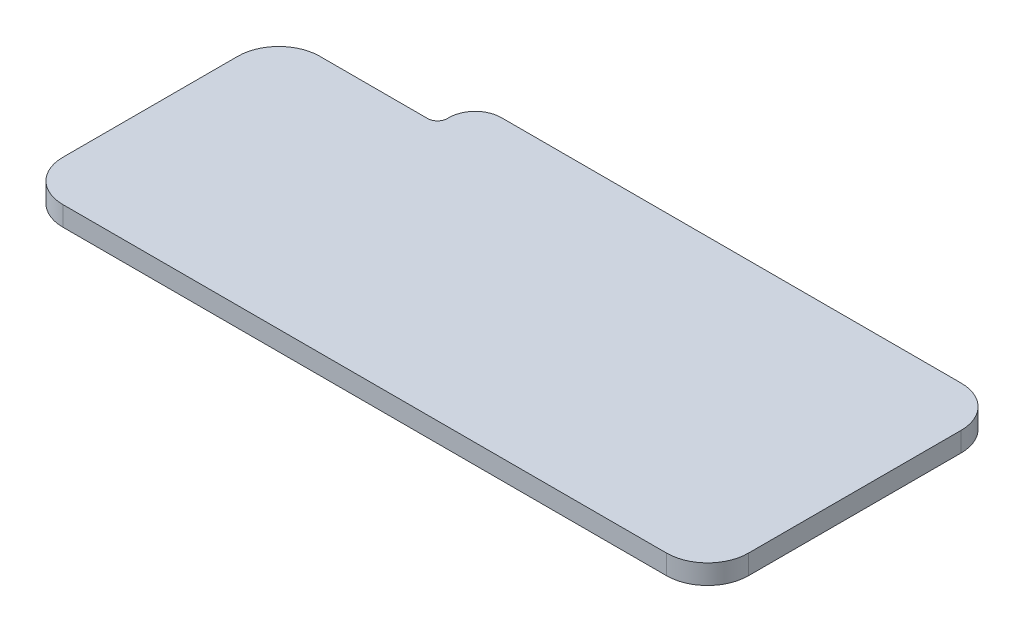
ISO-10303-21;
HEADER;
FILE_DESCRIPTION(('STEP AP214'),'2;1');
FILE_NAME('part.step','',(''),(''),'','','');
FILE_SCHEMA(('AUTOMOTIVE_DESIGN { 1 0 10303 214 1 1 1 1 }'));
ENDSEC;
DATA;
#1=APPLICATION_CONTEXT('core data for automotive mechanical design processes');
#2=APPLICATION_PROTOCOL_DEFINITION('international standard','automotive_design',2000,#1);
#3=PRODUCT_CONTEXT('',#1,'mechanical');
#4=PRODUCT('Part','Part','',(#3));
#5=PRODUCT_RELATED_PRODUCT_CATEGORY('part','',(#4));
#6=PRODUCT_DEFINITION_FORMATION('','',#4);
#7=PRODUCT_DEFINITION_CONTEXT('part definition',#1,'design');
#8=PRODUCT_DEFINITION('design','',#6,#7);
#9=PRODUCT_DEFINITION_SHAPE('','',#8);
#10=(LENGTH_UNIT() NAMED_UNIT(*) SI_UNIT(.MILLI.,.METRE.));
#11=(NAMED_UNIT(*) PLANE_ANGLE_UNIT() SI_UNIT($,.RADIAN.));
#12=(NAMED_UNIT(*) SI_UNIT($,.STERADIAN.) SOLID_ANGLE_UNIT());
#13=UNCERTAINTY_MEASURE_WITH_UNIT(LENGTH_MEASURE(1.E-05),#10,'distance_accuracy_value','');
#14=(GEOMETRIC_REPRESENTATION_CONTEXT(3) GLOBAL_UNCERTAINTY_ASSIGNED_CONTEXT((#13)) GLOBAL_UNIT_ASSIGNED_CONTEXT((#10,
#11,#12)) REPRESENTATION_CONTEXT('',''));
#15=CARTESIAN_POINT('',(0.,0.,0.));
#16=DIRECTION('',(0.,0.,1.));
#17=DIRECTION('',(1.,0.,0.));
#18=AXIS2_PLACEMENT_3D('',#15,#16,#17);
#19=CARTESIAN_POINT('',(0.,12.,0.));
#20=DIRECTION('',(0.,0.,-1.));
#21=DIRECTION('',(-1.,0.,0.));
#22=AXIS2_PLACEMENT_3D('',#19,#20,#21);
#23=PLANE('',#22);
#24=DIRECTION('',(1.,0.,0.));
#25=VECTOR('',#24,1.);
#26=CARTESIAN_POINT('',(0.,0.,0.));
#27=LINE('',#26,#25);
#28=CARTESIAN_POINT('',(-71.9999999999998,0.,0.));
#29=VERTEX_POINT('',#28);
#30=CARTESIAN_POINT('',(297.,0.,0.));
#31=VERTEX_POINT('',#30);
#32=EDGE_CURVE('E107',#29,#31,#27,.T.);
#33=ORIENTED_EDGE('',*,*,#32,.T.);
#34=DIRECTION('',(0.,-1.,0.));
#35=VECTOR('',#34,1.);
#36=CARTESIAN_POINT('',(297.,12.,0.));
#37=LINE('',#36,#35);
#38=CARTESIAN_POINT('',(297.,12.,0.));
#39=VERTEX_POINT('',#38);
#40=EDGE_CURVE('E11',#39,#31,#37,.T.);
#41=ORIENTED_EDGE('',*,*,#40,.F.);
#42=DIRECTION('',(1.,0.,0.));
#43=VECTOR('',#42,1.);
#44=CARTESIAN_POINT('',(0.,12.,0.));
#45=LINE('',#44,#43);
#46=CARTESIAN_POINT('',(-71.9999999999998,12.,0.));
#47=VERTEX_POINT('',#46);
#48=EDGE_CURVE('E113',#47,#39,#45,.T.);
#49=ORIENTED_EDGE('',*,*,#48,.F.);
#50=DIRECTION('',(0.,-1.,0.));
#51=VECTOR('',#50,1.);
#52=CARTESIAN_POINT('',(-71.9999999999998,12.,0.));
#53=LINE('',#52,#51);
#54=EDGE_CURVE('E159',#47,#29,#53,.T.);
#55=ORIENTED_EDGE('',*,*,#54,.T.);
#56=EDGE_LOOP('',(#33,#41,#49,#55));
#57=FACE_BOUND('',#56,.T.);
#58=ADVANCED_FACE('F43',(#57),#23,.F.);
#59=CARTESIAN_POINT('',(297.,12.,-25.));
#60=DIRECTION('',(0.,-1.,0.));
#61=DIRECTION('',(0.,0.,-1.));
#62=AXIS2_PLACEMENT_3D('',#59,#60,#61);
#63=CYLINDRICAL_SURFACE('',#62,25.);
#64=CARTESIAN_POINT('',(297.,0.,-25.));
#65=DIRECTION('',(0.,1.,0.));
#66=DIRECTION('',(0.,0.,1.));
#67=AXIS2_PLACEMENT_3D('',#64,#65,#66);
#68=CIRCLE('',#67,25.);
#69=CARTESIAN_POINT('',(322.,0.,-25.0000000000002));
#70=VERTEX_POINT('',#69);
#71=EDGE_CURVE('E164',#31,#70,#68,.T.);
#72=ORIENTED_EDGE('',*,*,#71,.T.);
#73=DIRECTION('',(0.,-1.,0.));
#74=VECTOR('',#73,1.);
#75=CARTESIAN_POINT('',(322.,12.,-25.0000000000002));
#76=LINE('',#75,#74);
#77=CARTESIAN_POINT('',(322.,12.,-25.0000000000002));
#78=VERTEX_POINT('',#77);
#79=EDGE_CURVE('E51',#78,#70,#76,.T.);
#80=ORIENTED_EDGE('',*,*,#79,.F.);
#81=CARTESIAN_POINT('',(297.,12.,-25.));
#82=DIRECTION('',(0.,1.,0.));
#83=DIRECTION('',(0.,0.,1.));
#84=AXIS2_PLACEMENT_3D('',#81,#82,#83);
#85=CIRCLE('',#84,25.);
#86=EDGE_CURVE('E252',#39,#78,#85,.T.);
#87=ORIENTED_EDGE('',*,*,#86,.F.);
#88=ORIENTED_EDGE('',*,*,#40,.T.);
#89=EDGE_LOOP('',(#72,#80,#87,#88));
#90=FACE_BOUND('',#89,.T.);
#91=ADVANCED_FACE('F255',(#90),#63,.T.);
#92=CARTESIAN_POINT('',(322.,12.,-25.0000000000002));
#93=DIRECTION('',(-1.,0.,0.));
#94=DIRECTION('',(0.,0.,1.));
#95=AXIS2_PLACEMENT_3D('',#92,#93,#94);
#96=PLANE('',#95);
#97=DIRECTION('',(0.,0.,-1.));
#98=VECTOR('',#97,1.);
#99=CARTESIAN_POINT('',(322.,0.,-25.0000000000002));
#100=LINE('',#99,#98);
#101=CARTESIAN_POINT('',(322.,0.,-155.));
#102=VERTEX_POINT('',#101);
#103=EDGE_CURVE('E166',#70,#102,#100,.T.);
#104=ORIENTED_EDGE('',*,*,#103,.T.);
#105=DIRECTION('',(0.,-1.,0.));
#106=VECTOR('',#105,1.);
#107=CARTESIAN_POINT('',(322.,12.,-155.));
#108=LINE('',#107,#106);
#109=CARTESIAN_POINT('',(322.,12.,-155.));
#110=VERTEX_POINT('',#109);
#111=EDGE_CURVE('E203',#110,#102,#108,.T.);
#112=ORIENTED_EDGE('',*,*,#111,.F.);
#113=DIRECTION('',(0.,0.,-1.));
#114=VECTOR('',#113,1.);
#115=CARTESIAN_POINT('',(322.,12.,-25.0000000000002));
#116=LINE('',#115,#114);
#117=EDGE_CURVE('E212',#78,#110,#116,.T.);
#118=ORIENTED_EDGE('',*,*,#117,.F.);
#119=ORIENTED_EDGE('',*,*,#79,.T.);
#120=EDGE_LOOP('',(#104,#112,#118,#119));
#121=FACE_BOUND('',#120,.T.);
#122=ADVANCED_FACE('F210',(#121),#96,.F.);
#123=CARTESIAN_POINT('',(297.,12.,-155.));
#124=DIRECTION('',(0.,-1.,0.));
#125=DIRECTION('',(0.,0.,-1.));
#126=AXIS2_PLACEMENT_3D('',#123,#124,#125);
#127=CYLINDRICAL_SURFACE('',#126,25.);
#128=CARTESIAN_POINT('',(297.,0.,-155.));
#129=DIRECTION('',(0.,1.,0.));
#130=DIRECTION('',(0.,0.,-1.));
#131=AXIS2_PLACEMENT_3D('',#128,#129,#130);
#132=CIRCLE('',#131,25.);
#133=CARTESIAN_POINT('',(297.,0.,-180.));
#134=VERTEX_POINT('',#133);
#135=EDGE_CURVE('E168',#102,#134,#132,.T.);
#136=ORIENTED_EDGE('',*,*,#135,.T.);
#137=DIRECTION('',(0.,-1.,0.));
#138=VECTOR('',#137,1.);
#139=CARTESIAN_POINT('',(297.,12.,-180.));
#140=LINE('',#139,#138);
#141=CARTESIAN_POINT('',(297.,12.,-180.));
#142=VERTEX_POINT('',#141);
#143=EDGE_CURVE('E200',#142,#134,#140,.T.);
#144=ORIENTED_EDGE('',*,*,#143,.F.);
#145=CARTESIAN_POINT('',(297.,12.,-155.));
#146=DIRECTION('',(0.,1.,0.));
#147=DIRECTION('',(0.,0.,-1.));
#148=AXIS2_PLACEMENT_3D('',#145,#146,#147);
#149=CIRCLE('',#148,25.);
#150=EDGE_CURVE('E230',#110,#142,#149,.T.);
#151=ORIENTED_EDGE('',*,*,#150,.F.);
#152=ORIENTED_EDGE('',*,*,#111,.T.);
#153=EDGE_LOOP('',(#136,#144,#151,#152));
#154=FACE_BOUND('',#153,.T.);
#155=ADVANCED_FACE('F221',(#154),#127,.T.);
#156=CARTESIAN_POINT('',(16.0000000000001,12.,-180.));
#157=DIRECTION('',(0.,0.,1.));
#158=DIRECTION('',(1.,0.,0.));
#159=AXIS2_PLACEMENT_3D('',#156,#157,#158);
#160=PLANE('',#159);
#161=DIRECTION('',(-1.,0.,0.));
#162=VECTOR('',#161,1.);
#163=CARTESIAN_POINT('',(16.0000000000001,0.,-180.));
#164=LINE('',#163,#162);
#165=CARTESIAN_POINT('',(16.0000000000001,0.,-180.));
#166=VERTEX_POINT('',#165);
#167=EDGE_CURVE('E170',#134,#166,#164,.T.);
#168=ORIENTED_EDGE('',*,*,#167,.T.);
#169=DIRECTION('',(0.,-1.,0.));
#170=VECTOR('',#169,1.);
#171=CARTESIAN_POINT('',(16.0000000000001,12.,-180.));
#172=LINE('',#171,#170);
#173=CARTESIAN_POINT('',(16.0000000000001,12.,-180.));
#174=VERTEX_POINT('',#173);
#175=EDGE_CURVE('E197',#174,#166,#172,.T.);
#176=ORIENTED_EDGE('',*,*,#175,.F.);
#177=DIRECTION('',(-1.,0.,0.));
#178=VECTOR('',#177,1.);
#179=CARTESIAN_POINT('',(16.0000000000001,12.,-180.));
#180=LINE('',#179,#178);
#181=EDGE_CURVE('E227',#142,#174,#180,.T.);
#182=ORIENTED_EDGE('',*,*,#181,.F.);
#183=ORIENTED_EDGE('',*,*,#143,.T.);
#184=EDGE_LOOP('',(#168,#176,#182,#183));
#185=FACE_BOUND('',#184,.T.);
#186=ADVANCED_FACE('F225',(#185),#160,.F.);
#187=CARTESIAN_POINT('',(16.,12.,-164.));
#188=DIRECTION('',(0.,-1.,0.));
#189=DIRECTION('',(0.,0.,-1.));
#190=AXIS2_PLACEMENT_3D('',#187,#188,#189);
#191=CYLINDRICAL_SURFACE('',#190,16.);
#192=CARTESIAN_POINT('',(16.,0.,-164.));
#193=DIRECTION('',(0.,1.,0.));
#194=DIRECTION('',(0.,0.,-1.));
#195=AXIS2_PLACEMENT_3D('',#192,#193,#194);
#196=CIRCLE('',#195,16.);
#197=CARTESIAN_POINT('',(0.,0.,-164.));
#198=VERTEX_POINT('',#197);
#199=EDGE_CURVE('E172',#166,#198,#196,.T.);
#200=ORIENTED_EDGE('',*,*,#199,.T.);
#201=DIRECTION('',(0.,-1.,0.));
#202=VECTOR('',#201,1.);
#203=CARTESIAN_POINT('',(0.,12.,-164.));
#204=LINE('',#203,#202);
#205=CARTESIAN_POINT('',(0.,12.,-164.));
#206=VERTEX_POINT('',#205);
#207=EDGE_CURVE('E194',#206,#198,#204,.T.);
#208=ORIENTED_EDGE('',*,*,#207,.F.);
#209=CARTESIAN_POINT('',(16.,12.,-164.));
#210=DIRECTION('',(0.,1.,0.));
#211=DIRECTION('',(0.,0.,-1.));
#212=AXIS2_PLACEMENT_3D('',#209,#210,#211);
#213=CIRCLE('',#212,16.);
#214=EDGE_CURVE('E229',#174,#206,#213,.T.);
#215=ORIENTED_EDGE('',*,*,#214,.F.);
#216=ORIENTED_EDGE('',*,*,#175,.T.);
#217=EDGE_LOOP('',(#200,#208,#215,#216));
#218=FACE_BOUND('',#217,.T.);
#219=ADVANCED_FACE('F267',(#218),#191,.T.);
#220=CARTESIAN_POINT('',(0.,12.,-162.982));
#221=DIRECTION('',(1.,0.,0.));
#222=DIRECTION('',(0.,0.,-1.));
#223=AXIS2_PLACEMENT_3D('',#220,#221,#222);
#224=PLANE('',#223);
#225=DIRECTION('',(0.,0.,1.));
#226=VECTOR('',#225,1.);
#227=CARTESIAN_POINT('',(0.,0.,-162.982));
#228=LINE('',#227,#226);
#229=CARTESIAN_POINT('',(0.,0.,-162.982));
#230=VERTEX_POINT('',#229);
#231=EDGE_CURVE('E174',#198,#230,#228,.T.);
#232=ORIENTED_EDGE('',*,*,#231,.T.);
#233=DIRECTION('',(0.,-1.,0.));
#234=VECTOR('',#233,1.);
#235=CARTESIAN_POINT('',(0.,12.,-162.982));
#236=LINE('',#235,#234);
#237=CARTESIAN_POINT('',(0.,12.,-162.982));
#238=VERTEX_POINT('',#237);
#239=EDGE_CURVE('E191',#238,#230,#236,.T.);
#240=ORIENTED_EDGE('',*,*,#239,.F.);
#241=DIRECTION('',(0.,0.,1.));
#242=VECTOR('',#241,1.);
#243=CARTESIAN_POINT('',(0.,12.,-162.982));
#244=LINE('',#243,#242);
#245=EDGE_CURVE('E232',#206,#238,#244,.T.);
#246=ORIENTED_EDGE('',*,*,#245,.F.);
#247=ORIENTED_EDGE('',*,*,#207,.T.);
#248=EDGE_LOOP('',(#232,#240,#246,#247));
#249=FACE_BOUND('',#248,.T.);
#250=ADVANCED_FACE('F270',(#249),#224,.F.);
#251=CARTESIAN_POINT('',(-6.,12.,-162.982));
#252=DIRECTION('',(0.,-1.,0.));
#253=DIRECTION('',(0.,0.,-1.));
#254=AXIS2_PLACEMENT_3D('',#251,#252,#253);
#255=CYLINDRICAL_SURFACE('',#254,6.);
#256=CARTESIAN_POINT('',(-6.,0.,-162.982));
#257=DIRECTION('',(0.,-1.,0.));
#258=DIRECTION('',(0.,0.,-1.));
#259=AXIS2_PLACEMENT_3D('',#256,#257,#258);
#260=CIRCLE('',#259,6.);
#261=CARTESIAN_POINT('',(-6.00000000000004,0.,-156.982));
#262=VERTEX_POINT('',#261);
#263=EDGE_CURVE('E176',#230,#262,#260,.T.);
#264=ORIENTED_EDGE('',*,*,#263,.T.);
#265=DIRECTION('',(0.,-1.,0.));
#266=VECTOR('',#265,1.);
#267=CARTESIAN_POINT('',(-6.00000000000004,12.,-156.982));
#268=LINE('',#267,#266);
#269=CARTESIAN_POINT('',(-6.00000000000004,12.,-156.982));
#270=VERTEX_POINT('',#269);
#271=EDGE_CURVE('E188',#270,#262,#268,.T.);
#272=ORIENTED_EDGE('',*,*,#271,.F.);
#273=CARTESIAN_POINT('',(-6.,12.,-162.982));
#274=DIRECTION('',(0.,-1.,0.));
#275=DIRECTION('',(0.,0.,-1.));
#276=AXIS2_PLACEMENT_3D('',#273,#274,#275);
#277=CIRCLE('',#276,6.);
#278=EDGE_CURVE('E238',#238,#270,#277,.T.);
#279=ORIENTED_EDGE('',*,*,#278,.F.);
#280=ORIENTED_EDGE('',*,*,#239,.T.);
#281=EDGE_LOOP('',(#264,#272,#279,#280));
#282=FACE_BOUND('',#281,.T.);
#283=ADVANCED_FACE('F244',(#282),#255,.F.);
#284=CARTESIAN_POINT('',(-6.00000000000004,12.,-156.982));
#285=DIRECTION('',(0.,0.,1.));
#286=DIRECTION('',(1.,0.,0.));
#287=AXIS2_PLACEMENT_3D('',#284,#285,#286);
#288=PLANE('',#287);
#289=DIRECTION('',(-1.,0.,0.));
#290=VECTOR('',#289,1.);
#291=CARTESIAN_POINT('',(-6.00000000000004,0.,-156.982));
#292=LINE('',#291,#290);
#293=CARTESIAN_POINT('',(-71.9999999999998,0.,-156.982));
#294=VERTEX_POINT('',#293);
#295=EDGE_CURVE('E178',#262,#294,#292,.T.);
#296=ORIENTED_EDGE('',*,*,#295,.T.);
#297=DIRECTION('',(0.,-1.,0.));
#298=VECTOR('',#297,1.);
#299=CARTESIAN_POINT('',(-71.9999999999998,12.,-156.982));
#300=LINE('',#299,#298);
#301=CARTESIAN_POINT('',(-71.9999999999998,12.,-156.982));
#302=VERTEX_POINT('',#301);
#303=EDGE_CURVE('E154',#302,#294,#300,.T.);
#304=ORIENTED_EDGE('',*,*,#303,.F.);
#305=DIRECTION('',(-1.,0.,0.));
#306=VECTOR('',#305,1.);
#307=CARTESIAN_POINT('',(-6.00000000000004,12.,-156.982));
#308=LINE('',#307,#306);
#309=EDGE_CURVE('E145',#270,#302,#308,.T.);
#310=ORIENTED_EDGE('',*,*,#309,.F.);
#311=ORIENTED_EDGE('',*,*,#271,.T.);
#312=EDGE_LOOP('',(#296,#304,#310,#311));
#313=FACE_BOUND('',#312,.T.);
#314=ADVANCED_FACE('F248',(#313),#288,.F.);
#315=CARTESIAN_POINT('',(-72.,12.,-131.982));
#316=DIRECTION('',(0.,-1.,0.));
#317=DIRECTION('',(0.,0.,-1.));
#318=AXIS2_PLACEMENT_3D('',#315,#316,#317);
#319=CYLINDRICAL_SURFACE('',#318,25.);
#320=CARTESIAN_POINT('',(-72.,0.,-131.982));
#321=DIRECTION('',(0.,1.,0.));
#322=DIRECTION('',(0.,0.,1.));
#323=AXIS2_PLACEMENT_3D('',#320,#321,#322);
#324=CIRCLE('',#323,25.);
#325=CARTESIAN_POINT('',(-97.,0.,-131.982));
#326=VERTEX_POINT('',#325);
#327=EDGE_CURVE('E153',#294,#326,#324,.T.);
#328=ORIENTED_EDGE('',*,*,#327,.T.);
#329=DIRECTION('',(0.,-1.,0.));
#330=VECTOR('',#329,1.);
#331=CARTESIAN_POINT('',(-97.,12.,-131.982));
#332=LINE('',#331,#330);
#333=CARTESIAN_POINT('',(-97.,12.,-131.982));
#334=VERTEX_POINT('',#333);
#335=EDGE_CURVE('E150',#334,#326,#332,.T.);
#336=ORIENTED_EDGE('',*,*,#335,.F.);
#337=CARTESIAN_POINT('',(-72.,12.,-131.982));
#338=DIRECTION('',(0.,1.,0.));
#339=DIRECTION('',(0.,0.,1.));
#340=AXIS2_PLACEMENT_3D('',#337,#338,#339);
#341=CIRCLE('',#340,25.);
#342=EDGE_CURVE('E139',#302,#334,#341,.T.);
#343=ORIENTED_EDGE('',*,*,#342,.F.);
#344=ORIENTED_EDGE('',*,*,#303,.T.);
#345=EDGE_LOOP('',(#328,#336,#343,#344));
#346=FACE_BOUND('',#345,.T.);
#347=ADVANCED_FACE('F151',(#346),#319,.T.);
#348=CARTESIAN_POINT('',(-97.,12.,-25.0000000000002));
#349=DIRECTION('',(1.,0.,0.));
#350=DIRECTION('',(0.,0.,-1.));
#351=AXIS2_PLACEMENT_3D('',#348,#349,#350);
#352=PLANE('',#351);
#353=DIRECTION('',(0.,0.,1.));
#354=VECTOR('',#353,1.);
#355=CARTESIAN_POINT('',(-97.,0.,-25.0000000000002));
#356=LINE('',#355,#354);
#357=CARTESIAN_POINT('',(-97.,0.,-25.0000000000002));
#358=VERTEX_POINT('',#357);
#359=EDGE_CURVE('E100',#326,#358,#356,.T.);
#360=ORIENTED_EDGE('',*,*,#359,.T.);
#361=DIRECTION('',(0.,-1.,0.));
#362=VECTOR('',#361,1.);
#363=CARTESIAN_POINT('',(-97.,12.,-25.0000000000002));
#364=LINE('',#363,#362);
#365=CARTESIAN_POINT('',(-97.,12.,-25.0000000000002));
#366=VERTEX_POINT('',#365);
#367=EDGE_CURVE('E155',#366,#358,#364,.T.);
#368=ORIENTED_EDGE('',*,*,#367,.F.);
#369=DIRECTION('',(0.,0.,1.));
#370=VECTOR('',#369,1.);
#371=CARTESIAN_POINT('',(-97.,12.,-25.0000000000002));
#372=LINE('',#371,#370);
#373=EDGE_CURVE('E143',#334,#366,#372,.T.);
#374=ORIENTED_EDGE('',*,*,#373,.F.);
#375=ORIENTED_EDGE('',*,*,#335,.T.);
#376=EDGE_LOOP('',(#360,#368,#374,#375));
#377=FACE_BOUND('',#376,.T.);
#378=ADVANCED_FACE('F157',(#377),#352,.F.);
#379=CARTESIAN_POINT('',(-72.,12.,-25.));
#380=DIRECTION('',(0.,-1.,0.));
#381=DIRECTION('',(0.,0.,-1.));
#382=AXIS2_PLACEMENT_3D('',#379,#380,#381);
#383=CYLINDRICAL_SURFACE('',#382,25.);
#384=CARTESIAN_POINT('',(-72.,0.,-25.));
#385=DIRECTION('',(0.,1.,0.));
#386=DIRECTION('',(0.,0.,-1.));
#387=AXIS2_PLACEMENT_3D('',#384,#385,#386);
#388=CIRCLE('',#387,25.);
#389=EDGE_CURVE('E182',#358,#29,#388,.T.);
#390=ORIENTED_EDGE('',*,*,#389,.T.);
#391=ORIENTED_EDGE('',*,*,#54,.F.);
#392=CARTESIAN_POINT('',(-72.,12.,-25.));
#393=DIRECTION('',(0.,1.,0.));
#394=DIRECTION('',(0.,0.,-1.));
#395=AXIS2_PLACEMENT_3D('',#392,#393,#394);
#396=CIRCLE('',#395,25.);
#397=EDGE_CURVE('E59',#366,#47,#396,.T.);
#398=ORIENTED_EDGE('',*,*,#397,.F.);
#399=ORIENTED_EDGE('',*,*,#367,.T.);
#400=EDGE_LOOP('',(#390,#391,#398,#399));
#401=FACE_BOUND('',#400,.T.);
#402=ADVANCED_FACE('F250',(#401),#383,.T.);
#403=CARTESIAN_POINT('',(-72.,12.,-25.));
#404=DIRECTION('',(0.,-1.,0.));
#405=DIRECTION('',(0.,0.,-1.));
#406=AXIS2_PLACEMENT_3D('',#403,#404,#405);
#407=PLANE('',#406);
#408=ORIENTED_EDGE('',*,*,#48,.T.);
#409=ORIENTED_EDGE('',*,*,#86,.T.);
#410=ORIENTED_EDGE('',*,*,#117,.T.);
#411=ORIENTED_EDGE('',*,*,#150,.T.);
#412=ORIENTED_EDGE('',*,*,#181,.T.);
#413=ORIENTED_EDGE('',*,*,#214,.T.);
#414=ORIENTED_EDGE('',*,*,#245,.T.);
#415=ORIENTED_EDGE('',*,*,#278,.T.);
#416=ORIENTED_EDGE('',*,*,#309,.T.);
#417=ORIENTED_EDGE('',*,*,#342,.T.);
#418=ORIENTED_EDGE('',*,*,#373,.T.);
#419=ORIENTED_EDGE('',*,*,#397,.T.);
#420=EDGE_LOOP('',(#408,#409,#410,#411,#412,#413,#414,#415,#416,#417,#418,#419));
#421=FACE_BOUND('',#420,.T.);
#422=ADVANCED_FACE('F141',(#421),#407,.F.);
#423=CARTESIAN_POINT('',(-72.,0.,-25.));
#424=DIRECTION('',(0.,-1.,0.));
#425=DIRECTION('',(0.,0.,-1.));
#426=AXIS2_PLACEMENT_3D('',#423,#424,#425);
#427=PLANE('',#426);
#428=ORIENTED_EDGE('',*,*,#32,.F.);
#429=ORIENTED_EDGE('',*,*,#389,.F.);
#430=ORIENTED_EDGE('',*,*,#359,.F.);
#431=ORIENTED_EDGE('',*,*,#327,.F.);
#432=ORIENTED_EDGE('',*,*,#295,.F.);
#433=ORIENTED_EDGE('',*,*,#263,.F.);
#434=ORIENTED_EDGE('',*,*,#231,.F.);
#435=ORIENTED_EDGE('',*,*,#199,.F.);
#436=ORIENTED_EDGE('',*,*,#167,.F.);
#437=ORIENTED_EDGE('',*,*,#135,.F.);
#438=ORIENTED_EDGE('',*,*,#103,.F.);
#439=ORIENTED_EDGE('',*,*,#71,.F.);
#440=EDGE_LOOP('',(#428,#429,#430,#431,#432,#433,#434,#435,#436,#437,#438,#439));
#441=FACE_BOUND('',#440,.T.);
#442=ADVANCED_FACE('F216',(#441),#427,.T.);
#443=CLOSED_SHELL('',(#58,#91,#122,#155,#186,#219,#250,#283,#314,#347,#378,#402,#422,#442));
#444=MANIFOLD_SOLID_BREP('B2',#443);
#445=ADVANCED_BREP_SHAPE_REPRESENTATION('',(#18,#444),#14);
#446=SHAPE_DEFINITION_REPRESENTATION(#9,#445);
ENDSEC;
END-ISO-10303-21;
